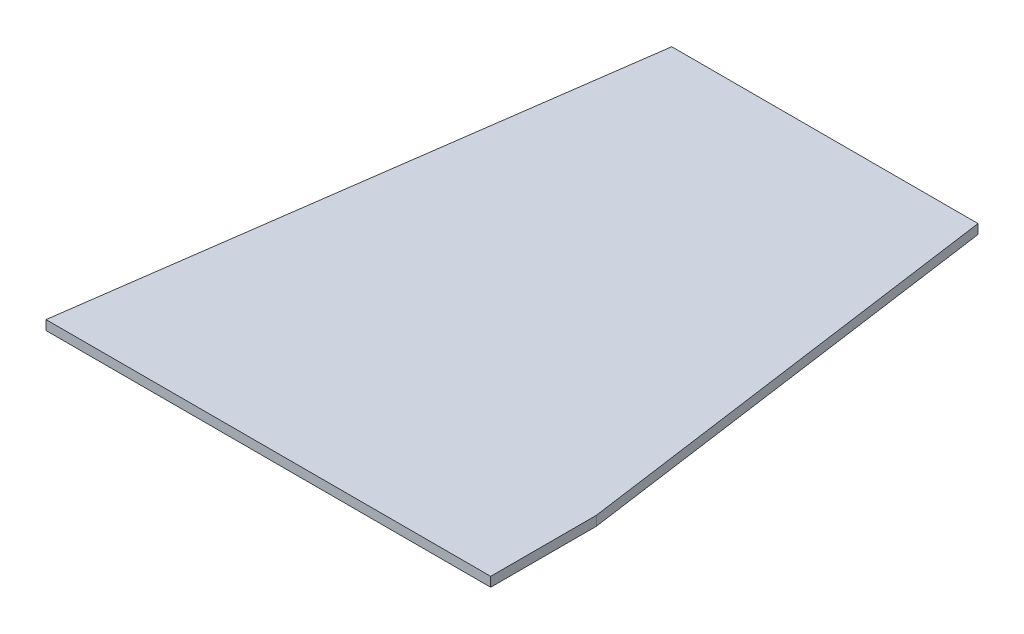
ISO-10303-21;
HEADER;
FILE_DESCRIPTION(('STEP AP214'),'2;1');
FILE_NAME('part.step','',(''),(''),'','','');
FILE_SCHEMA(('AUTOMOTIVE_DESIGN { 1 0 10303 214 1 1 1 1 }'));
ENDSEC;
DATA;
#1=APPLICATION_CONTEXT('core data for automotive mechanical design processes');
#2=APPLICATION_PROTOCOL_DEFINITION('international standard','automotive_design',2000,#1);
#3=PRODUCT_CONTEXT('',#1,'mechanical');
#4=PRODUCT('Part','Part','',(#3));
#5=PRODUCT_RELATED_PRODUCT_CATEGORY('part','',(#4));
#6=PRODUCT_DEFINITION_FORMATION('','',#4);
#7=PRODUCT_DEFINITION_CONTEXT('part definition',#1,'design');
#8=PRODUCT_DEFINITION('design','',#6,#7);
#9=PRODUCT_DEFINITION_SHAPE('','',#8);
#10=(LENGTH_UNIT() NAMED_UNIT(*) SI_UNIT(.MILLI.,.METRE.));
#11=(NAMED_UNIT(*) PLANE_ANGLE_UNIT() SI_UNIT($,.RADIAN.));
#12=(NAMED_UNIT(*) SI_UNIT($,.STERADIAN.) SOLID_ANGLE_UNIT());
#13=UNCERTAINTY_MEASURE_WITH_UNIT(LENGTH_MEASURE(1.E-05),#10,'distance_accuracy_value','');
#14=(GEOMETRIC_REPRESENTATION_CONTEXT(3) GLOBAL_UNCERTAINTY_ASSIGNED_CONTEXT((#13)) GLOBAL_UNIT_ASSIGNED_CONTEXT((#10,
#11,#12)) REPRESENTATION_CONTEXT('',''));
#15=CARTESIAN_POINT('',(0.,0.,0.));
#16=DIRECTION('',(0.,0.,1.));
#17=DIRECTION('',(1.,0.,0.));
#18=AXIS2_PLACEMENT_3D('',#15,#16,#17);
#19=CARTESIAN_POINT('',(87.,1.8,0.));
#20=DIRECTION('',(0.,0.,-1.));
#21=DIRECTION('',(-1.,0.,0.));
#22=AXIS2_PLACEMENT_3D('',#19,#20,#21);
#23=PLANE('',#22);
#24=DIRECTION('',(1.,0.,0.));
#25=VECTOR('',#24,1.);
#26=CARTESIAN_POINT('',(87.,0.,0.));
#27=LINE('',#26,#25);
#28=CARTESIAN_POINT('',(0.,0.,0.));
#29=VERTEX_POINT('',#28);
#30=CARTESIAN_POINT('',(84.2115384615385,0.,0.));
#31=VERTEX_POINT('',#30);
#32=EDGE_CURVE('E104',#29,#31,#27,.T.);
#33=ORIENTED_EDGE('',*,*,#32,.T.);
#34=DIRECTION('',(0.,1.,0.));
#35=VECTOR('',#34,1.);
#36=CARTESIAN_POINT('',(84.2115384615385,0.,0.));
#37=LINE('',#36,#35);
#38=CARTESIAN_POINT('',(84.2115384615385,1.8,0.));
#39=VERTEX_POINT('',#38);
#40=EDGE_CURVE('E52',#31,#39,#37,.T.);
#41=ORIENTED_EDGE('',*,*,#40,.T.);
#42=DIRECTION('',(1.,0.,0.));
#43=VECTOR('',#42,1.);
#44=CARTESIAN_POINT('',(87.,1.8,0.));
#45=LINE('',#44,#43);
#46=CARTESIAN_POINT('',(0.,1.8,0.));
#47=VERTEX_POINT('',#46);
#48=EDGE_CURVE('E115',#47,#39,#45,.T.);
#49=ORIENTED_EDGE('',*,*,#48,.F.);
#50=DIRECTION('',(0.,-1.,0.));
#51=VECTOR('',#50,1.);
#52=CARTESIAN_POINT('',(0.,1.8,0.));
#53=LINE('',#52,#51);
#54=EDGE_CURVE('E116',#47,#29,#53,.T.);
#55=ORIENTED_EDGE('',*,*,#54,.T.);
#56=EDGE_LOOP('',(#33,#41,#49,#55));
#57=FACE_BOUND('',#56,.T.);
#58=ADVANCED_FACE('F38',(#57),#23,.F.);
#59=CARTESIAN_POINT('',(72.5,1.8,-104.));
#60=DIRECTION('',(-0.990420045806447,0.,0.13808741023263));
#61=DIRECTION('',(0.13808741023263,0.,0.990420045806447));
#62=AXIS2_PLACEMENT_3D('',#59,#60,#61);
#63=PLANE('',#62);
#64=DIRECTION('',(-0.13808741023263,0.,-0.990420045806447));
#65=VECTOR('',#64,1.);
#66=CARTESIAN_POINT('',(72.5,1.8,-104.));
#67=LINE('',#66,#65);
#68=CARTESIAN_POINT('',(84.2115384615385,1.8,-20.));
#69=VERTEX_POINT('',#68);
#70=CARTESIAN_POINT('',(72.5,1.8,-104.));
#71=VERTEX_POINT('',#70);
#72=EDGE_CURVE('E83',#69,#71,#67,.T.);
#73=ORIENTED_EDGE('',*,*,#72,.F.);
#74=DIRECTION('',(0.,1.,0.));
#75=VECTOR('',#74,1.);
#76=CARTESIAN_POINT('',(84.2115384615385,0.,-20.));
#77=LINE('',#76,#75);
#78=CARTESIAN_POINT('',(84.2115384615385,0.,-20.));
#79=VERTEX_POINT('',#78);
#80=EDGE_CURVE('E94',#79,#69,#77,.T.);
#81=ORIENTED_EDGE('',*,*,#80,.F.);
#82=DIRECTION('',(-0.13808741023263,0.,-0.990420045806447));
#83=VECTOR('',#82,1.);
#84=CARTESIAN_POINT('',(72.5,0.,-104.));
#85=LINE('',#84,#83);
#86=CARTESIAN_POINT('',(72.5,0.,-104.));
#87=VERTEX_POINT('',#86);
#88=EDGE_CURVE('E103',#79,#87,#85,.T.);
#89=ORIENTED_EDGE('',*,*,#88,.T.);
#90=DIRECTION('',(0.,-1.,0.));
#91=VECTOR('',#90,1.);
#92=CARTESIAN_POINT('',(72.5,1.8,-104.));
#93=LINE('',#92,#91);
#94=EDGE_CURVE('E11',#71,#87,#93,.T.);
#95=ORIENTED_EDGE('',*,*,#94,.F.);
#96=EDGE_LOOP('',(#73,#81,#89,#95));
#97=FACE_BOUND('',#96,.T.);
#98=ADVANCED_FACE('F102',(#97),#63,.F.);
#99=CARTESIAN_POINT('',(14.5,1.8,-104.));
#100=DIRECTION('',(0.,0.,1.));
#101=DIRECTION('',(1.,0.,0.));
#102=AXIS2_PLACEMENT_3D('',#99,#100,#101);
#103=PLANE('',#102);
#104=DIRECTION('',(-1.,0.,0.));
#105=VECTOR('',#104,1.);
#106=CARTESIAN_POINT('',(14.5,0.,-104.));
#107=LINE('',#106,#105);
#108=CARTESIAN_POINT('',(14.5,0.,-104.));
#109=VERTEX_POINT('',#108);
#110=EDGE_CURVE('E108',#87,#109,#107,.T.);
#111=ORIENTED_EDGE('',*,*,#110,.T.);
#112=DIRECTION('',(0.,-1.,0.));
#113=VECTOR('',#112,1.);
#114=CARTESIAN_POINT('',(14.5,1.8,-104.));
#115=LINE('',#114,#113);
#116=CARTESIAN_POINT('',(14.5,1.8,-104.));
#117=VERTEX_POINT('',#116);
#118=EDGE_CURVE('E45',#117,#109,#115,.T.);
#119=ORIENTED_EDGE('',*,*,#118,.F.);
#120=DIRECTION('',(-1.,0.,0.));
#121=VECTOR('',#120,1.);
#122=CARTESIAN_POINT('',(14.5,1.8,-104.));
#123=LINE('',#122,#121);
#124=EDGE_CURVE('E124',#71,#117,#123,.T.);
#125=ORIENTED_EDGE('',*,*,#124,.F.);
#126=ORIENTED_EDGE('',*,*,#94,.T.);
#127=EDGE_LOOP('',(#111,#119,#125,#126));
#128=FACE_BOUND('',#127,.T.);
#129=ADVANCED_FACE('F129',(#128),#103,.F.);
#130=CARTESIAN_POINT('',(0.,1.8,0.));
#131=DIRECTION('',(0.990420045806447,0.,0.13808741023263));
#132=DIRECTION('',(0.13808741023263,0.,-0.990420045806447));
#133=AXIS2_PLACEMENT_3D('',#130,#131,#132);
#134=PLANE('',#133);
#135=DIRECTION('',(-0.13808741023263,0.,0.990420045806447));
#136=VECTOR('',#135,1.);
#137=CARTESIAN_POINT('',(0.,0.,0.));
#138=LINE('',#137,#136);
#139=EDGE_CURVE('E78',#109,#29,#138,.T.);
#140=ORIENTED_EDGE('',*,*,#139,.T.);
#141=ORIENTED_EDGE('',*,*,#54,.F.);
#142=DIRECTION('',(-0.13808741023263,0.,0.990420045806447));
#143=VECTOR('',#142,1.);
#144=CARTESIAN_POINT('',(0.,1.8,0.));
#145=LINE('',#144,#143);
#146=EDGE_CURVE('E61',#117,#47,#145,.T.);
#147=ORIENTED_EDGE('',*,*,#146,.F.);
#148=ORIENTED_EDGE('',*,*,#118,.T.);
#149=EDGE_LOOP('',(#140,#141,#147,#148));
#150=FACE_BOUND('',#149,.T.);
#151=ADVANCED_FACE('F118',(#150),#134,.F.);
#152=CARTESIAN_POINT('',(0.,1.8,0.));
#153=DIRECTION('',(0.,-1.,0.));
#154=DIRECTION('',(0.,0.,-1.));
#155=AXIS2_PLACEMENT_3D('',#152,#153,#154);
#156=PLANE('',#155);
#157=ORIENTED_EDGE('',*,*,#48,.T.);
#158=DIRECTION('',(0.,0.,1.));
#159=VECTOR('',#158,1.);
#160=CARTESIAN_POINT('',(84.2115384615385,1.8,-20.));
#161=LINE('',#160,#159);
#162=EDGE_CURVE('E99',#69,#39,#161,.T.);
#163=ORIENTED_EDGE('',*,*,#162,.F.);
#164=ORIENTED_EDGE('',*,*,#72,.T.);
#165=ORIENTED_EDGE('',*,*,#124,.T.);
#166=ORIENTED_EDGE('',*,*,#146,.T.);
#167=EDGE_LOOP('',(#157,#163,#164,#165,#166));
#168=FACE_BOUND('',#167,.T.);
#169=ADVANCED_FACE('F128',(#168),#156,.F.);
#170=CARTESIAN_POINT('',(0.,0.,0.));
#171=DIRECTION('',(0.,-1.,0.));
#172=DIRECTION('',(0.,0.,-1.));
#173=AXIS2_PLACEMENT_3D('',#170,#171,#172);
#174=PLANE('',#173);
#175=DIRECTION('',(0.,0.,1.));
#176=VECTOR('',#175,1.);
#177=CARTESIAN_POINT('',(84.2115384615385,0.,-20.));
#178=LINE('',#177,#176);
#179=EDGE_CURVE('E91',#79,#31,#178,.T.);
#180=ORIENTED_EDGE('',*,*,#179,.T.);
#181=ORIENTED_EDGE('',*,*,#32,.F.);
#182=ORIENTED_EDGE('',*,*,#139,.F.);
#183=ORIENTED_EDGE('',*,*,#110,.F.);
#184=ORIENTED_EDGE('',*,*,#88,.F.);
#185=EDGE_LOOP('',(#180,#181,#182,#183,#184));
#186=FACE_BOUND('',#185,.T.);
#187=ADVANCED_FACE('F107',(#186),#174,.T.);
#188=CARTESIAN_POINT('',(84.2115384615385,0.,-20.));
#189=DIRECTION('',(-1.,0.,0.));
#190=DIRECTION('',(0.,0.,1.));
#191=AXIS2_PLACEMENT_3D('',#188,#189,#190);
#192=PLANE('',#191);
#193=ORIENTED_EDGE('',*,*,#162,.T.);
#194=ORIENTED_EDGE('',*,*,#40,.F.);
#195=ORIENTED_EDGE('',*,*,#179,.F.);
#196=ORIENTED_EDGE('',*,*,#80,.T.);
#197=EDGE_LOOP('',(#193,#194,#195,#196));
#198=FACE_BOUND('',#197,.T.);
#199=ADVANCED_FACE('F93',(#198),#192,.F.);
#200=CLOSED_SHELL('',(#58,#98,#129,#151,#169,#187,#199));
#201=MANIFOLD_SOLID_BREP('B2',#200);
#202=ADVANCED_BREP_SHAPE_REPRESENTATION('',(#18,#201),#14);
#203=SHAPE_DEFINITION_REPRESENTATION(#9,#202);
ENDSEC;
END-ISO-10303-21;
